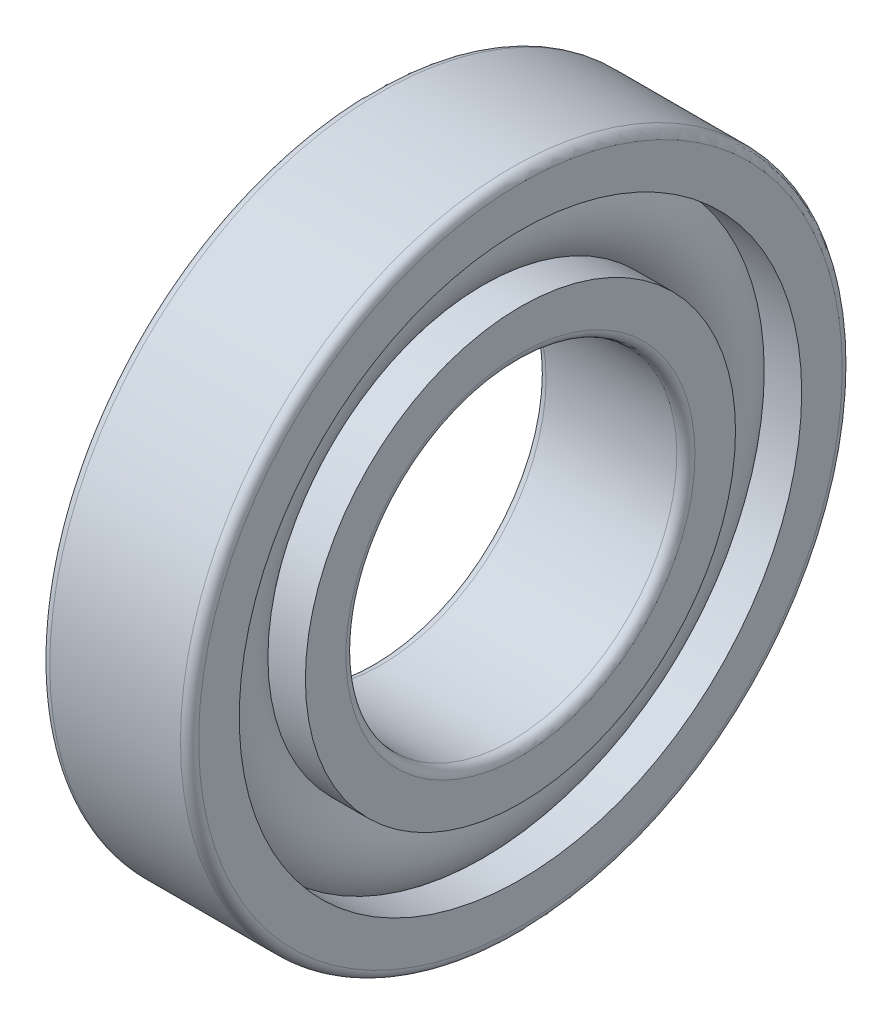
ISO-10303-21;
HEADER;
FILE_DESCRIPTION(('STEP AP214'),'2;1');
FILE_NAME('part.step','',(''),(''),'','','');
FILE_SCHEMA(('AUTOMOTIVE_DESIGN { 1 0 10303 214 1 1 1 1 }'));
ENDSEC;
DATA;
#1=APPLICATION_CONTEXT('core data for automotive mechanical design processes');
#2=APPLICATION_PROTOCOL_DEFINITION('international standard','automotive_design',2000,#1);
#3=PRODUCT_CONTEXT('',#1,'mechanical');
#4=PRODUCT('Part','Part','',(#3));
#5=PRODUCT_RELATED_PRODUCT_CATEGORY('part','',(#4));
#6=PRODUCT_DEFINITION_FORMATION('','',#4);
#7=PRODUCT_DEFINITION_CONTEXT('part definition',#1,'design');
#8=PRODUCT_DEFINITION('design','',#6,#7);
#9=PRODUCT_DEFINITION_SHAPE('','',#8);
#10=(LENGTH_UNIT() NAMED_UNIT(*) SI_UNIT(.MILLI.,.METRE.));
#11=(NAMED_UNIT(*) PLANE_ANGLE_UNIT() SI_UNIT($,.RADIAN.));
#12=(NAMED_UNIT(*) SI_UNIT($,.STERADIAN.) SOLID_ANGLE_UNIT());
#13=UNCERTAINTY_MEASURE_WITH_UNIT(LENGTH_MEASURE(1.E-05),#10,'distance_accuracy_value','');
#14=(GEOMETRIC_REPRESENTATION_CONTEXT(3) GLOBAL_UNCERTAINTY_ASSIGNED_CONTEXT((#13)) GLOBAL_UNIT_ASSIGNED_CONTEXT((#10,
#11,#12)) REPRESENTATION_CONTEXT('',''));
#15=CARTESIAN_POINT('',(0.,0.,0.));
#16=DIRECTION('',(0.,0.,1.));
#17=DIRECTION('',(1.,0.,0.));
#18=AXIS2_PLACEMENT_3D('',#15,#16,#17);
#19=CARTESIAN_POINT('',(0.,0.,0.));
#20=DIRECTION('',(-1.,0.,0.));
#21=DIRECTION('',(0.,0.,1.));
#22=AXIS2_PLACEMENT_3D('',#19,#20,#21);
#23=TOROIDAL_SURFACE('',#22,30.,6.);
#24=CARTESIAN_POINT('',(4.47213595499958,0.,0.));
#25=DIRECTION('',(-1.,0.,0.));
#26=DIRECTION('',(0.,0.,1.));
#27=AXIS2_PLACEMENT_3D('',#24,#25,#26);
#28=CIRCLE('',#27,34.);
#29=CARTESIAN_POINT('',(4.47213595499958,0.,34.));
#30=VERTEX_POINT('',#29);
#31=EDGE_CURVE('E17',#30,#30,#28,.F.);
#32=ORIENTED_EDGE('',*,*,#31,.T.);
#33=EDGE_LOOP('',(#32));
#34=FACE_BOUND('',#33,.T.);
#35=CARTESIAN_POINT('',(4.47213595499958,0.,0.));
#36=DIRECTION('',(-1.,0.,0.));
#37=DIRECTION('',(0.,0.,1.));
#38=AXIS2_PLACEMENT_3D('',#35,#36,#37);
#39=CIRCLE('',#38,26.);
#40=CARTESIAN_POINT('',(4.47213595499958,0.,26.));
#41=VERTEX_POINT('',#40);
#42=EDGE_CURVE('E8',#41,#41,#39,.T.);
#43=ORIENTED_EDGE('',*,*,#42,.T.);
#44=EDGE_LOOP('',(#43));
#45=FACE_BOUND('',#44,.T.);
#46=ADVANCED_FACE('F13',(#34,#45),#23,.T.);
#47=CARTESIAN_POINT('',(-20.6375,0.,0.));
#48=DIRECTION('',(1.,0.,0.));
#49=DIRECTION('',(0.,0.,-1.));
#50=AXIS2_PLACEMENT_3D('',#47,#48,#49);
#51=CYLINDRICAL_SURFACE('',#50,26.);
#52=CARTESIAN_POINT('',(9.,0.,0.));
#53=DIRECTION('',(1.,0.,0.));
#54=DIRECTION('',(0.,0.,-1.));
#55=AXIS2_PLACEMENT_3D('',#52,#53,#54);
#56=CIRCLE('',#55,26.);
#57=CARTESIAN_POINT('',(9.,0.,-26.));
#58=VERTEX_POINT('',#57);
#59=EDGE_CURVE('E26',#58,#58,#56,.T.);
#60=ORIENTED_EDGE('',*,*,#59,.F.);
#61=EDGE_LOOP('',(#60));
#62=FACE_BOUND('',#61,.T.);
#63=ORIENTED_EDGE('',*,*,#42,.F.);
#64=EDGE_LOOP('',(#63));
#65=FACE_BOUND('',#64,.T.);
#66=ADVANCED_FACE('F65',(#62,#65),#51,.T.);
#67=CARTESIAN_POINT('',(-20.6375,0.,0.));
#68=DIRECTION('',(1.,0.,0.));
#69=DIRECTION('',(0.,0.,-1.));
#70=AXIS2_PLACEMENT_3D('',#67,#68,#69);
#71=CYLINDRICAL_SURFACE('',#70,26.);
#72=CARTESIAN_POINT('',(-9.,0.,0.));
#73=DIRECTION('',(1.,0.,0.));
#74=DIRECTION('',(0.,0.,-1.));
#75=AXIS2_PLACEMENT_3D('',#72,#73,#74);
#76=CIRCLE('',#75,26.);
#77=CARTESIAN_POINT('',(-9.,0.,-26.));
#78=VERTEX_POINT('',#77);
#79=EDGE_CURVE('E35',#78,#78,#76,.T.);
#80=ORIENTED_EDGE('',*,*,#79,.T.);
#81=EDGE_LOOP('',(#80));
#82=FACE_BOUND('',#81,.T.);
#83=CARTESIAN_POINT('',(-4.47213595499958,0.,0.));
#84=DIRECTION('',(1.,0.,0.));
#85=DIRECTION('',(0.,0.,-1.));
#86=AXIS2_PLACEMENT_3D('',#83,#84,#85);
#87=CIRCLE('',#86,26.);
#88=CARTESIAN_POINT('',(-4.47213595499958,0.,-26.));
#89=VERTEX_POINT('',#88);
#90=EDGE_CURVE('E21',#89,#89,#87,.T.);
#91=ORIENTED_EDGE('',*,*,#90,.F.);
#92=EDGE_LOOP('',(#91));
#93=FACE_BOUND('',#92,.T.);
#94=ADVANCED_FACE('F68',(#82,#93),#71,.T.);
#95=CARTESIAN_POINT('',(9.,21.1,0.));
#96=DIRECTION('',(1.,0.,0.));
#97=DIRECTION('',(0.,0.,-1.));
#98=AXIS2_PLACEMENT_3D('',#95,#96,#97);
#99=PLANE('',#98);
#100=ORIENTED_EDGE('',*,*,#59,.T.);
#101=EDGE_LOOP('',(#100));
#102=FACE_BOUND('',#101,.T.);
#103=CARTESIAN_POINT('',(9.00000000000001,0.,0.));
#104=DIRECTION('',(1.,0.,0.));
#105=DIRECTION('',(0.,0.,-1.));
#106=AXIS2_PLACEMENT_3D('',#103,#104,#105);
#107=CIRCLE('',#106,21.1);
#108=CARTESIAN_POINT('',(9.00000000000001,0.,-21.1));
#109=VERTEX_POINT('',#108);
#110=EDGE_CURVE('E57',#109,#109,#107,.T.);
#111=ORIENTED_EDGE('',*,*,#110,.F.);
#112=EDGE_LOOP('',(#111));
#113=FACE_BOUND('',#112,.T.);
#114=ADVANCED_FACE('F62',(#102,#113),#99,.T.);
#115=CARTESIAN_POINT('',(7.9,0.,0.));
#116=DIRECTION('',(1.,0.,0.));
#117=DIRECTION('',(0.,0.,-1.));
#118=AXIS2_PLACEMENT_3D('',#115,#116,#117);
#119=TOROIDAL_SURFACE('',#118,21.1,1.10000000000001);
#120=ORIENTED_EDGE('',*,*,#110,.T.);
#121=EDGE_LOOP('',(#120));
#122=FACE_BOUND('',#121,.T.);
#123=CARTESIAN_POINT('',(7.9,0.,0.));
#124=DIRECTION('',(1.,0.,0.));
#125=DIRECTION('',(0.,0.,-1.));
#126=AXIS2_PLACEMENT_3D('',#123,#124,#125);
#127=CIRCLE('',#126,20.);
#128=CARTESIAN_POINT('',(7.9,0.,-20.));
#129=VERTEX_POINT('',#128);
#130=EDGE_CURVE('E54',#129,#129,#127,.T.);
#131=ORIENTED_EDGE('',*,*,#130,.F.);
#132=EDGE_LOOP('',(#131));
#133=FACE_BOUND('',#132,.T.);
#134=ADVANCED_FACE('F80',(#122,#133),#119,.T.);
#135=CARTESIAN_POINT('',(-20.6375,0.,0.));
#136=DIRECTION('',(1.,0.,0.));
#137=DIRECTION('',(0.,0.,-1.));
#138=AXIS2_PLACEMENT_3D('',#135,#136,#137);
#139=CYLINDRICAL_SURFACE('',#138,20.);
#140=ORIENTED_EDGE('',*,*,#130,.T.);
#141=EDGE_LOOP('',(#140));
#142=FACE_BOUND('',#141,.T.);
#143=CARTESIAN_POINT('',(-7.9,0.,0.));
#144=DIRECTION('',(1.,0.,0.));
#145=DIRECTION('',(0.,0.,-1.));
#146=AXIS2_PLACEMENT_3D('',#143,#144,#145);
#147=CIRCLE('',#146,20.);
#148=CARTESIAN_POINT('',(-7.9,0.,-20.));
#149=VERTEX_POINT('',#148);
#150=EDGE_CURVE('E51',#149,#149,#147,.T.);
#151=ORIENTED_EDGE('',*,*,#150,.F.);
#152=EDGE_LOOP('',(#151));
#153=FACE_BOUND('',#152,.T.);
#154=ADVANCED_FACE('F83',(#142,#153),#139,.F.);
#155=CARTESIAN_POINT('',(-7.9,0.,0.));
#156=DIRECTION('',(1.,0.,0.));
#157=DIRECTION('',(0.,0.,-1.));
#158=AXIS2_PLACEMENT_3D('',#155,#156,#157);
#159=TOROIDAL_SURFACE('',#158,21.1,1.10000000000001);
#160=ORIENTED_EDGE('',*,*,#150,.T.);
#161=EDGE_LOOP('',(#160));
#162=FACE_BOUND('',#161,.T.);
#163=CARTESIAN_POINT('',(-9.,0.,0.));
#164=DIRECTION('',(1.,0.,0.));
#165=DIRECTION('',(0.,0.,-1.));
#166=AXIS2_PLACEMENT_3D('',#163,#164,#165);
#167=CIRCLE('',#166,21.1);
#168=CARTESIAN_POINT('',(-9.,0.,-21.1));
#169=VERTEX_POINT('',#168);
#170=EDGE_CURVE('E48',#169,#169,#167,.T.);
#171=ORIENTED_EDGE('',*,*,#170,.F.);
#172=EDGE_LOOP('',(#171));
#173=FACE_BOUND('',#172,.T.);
#174=ADVANCED_FACE('F87',(#162,#173),#159,.T.);
#175=CARTESIAN_POINT('',(-9.,26.,0.));
#176=DIRECTION('',(-1.,0.,0.));
#177=DIRECTION('',(0.,0.,1.));
#178=AXIS2_PLACEMENT_3D('',#175,#176,#177);
#179=PLANE('',#178);
#180=ORIENTED_EDGE('',*,*,#170,.T.);
#181=EDGE_LOOP('',(#180));
#182=FACE_BOUND('',#181,.T.);
#183=ORIENTED_EDGE('',*,*,#79,.F.);
#184=EDGE_LOOP('',(#183));
#185=FACE_BOUND('',#184,.T.);
#186=ADVANCED_FACE('F91',(#182,#185),#179,.T.);
#187=CARTESIAN_POINT('',(-4.47213595499958,0.,0.));
#188=DIRECTION('',(1.,0.,0.));
#189=DIRECTION('',(0.,0.,-1.));
#190=AXIS2_PLACEMENT_3D('',#187,#188,#189);
#191=CIRCLE('',#190,34.);
#192=CARTESIAN_POINT('',(-4.47213595499958,0.,-34.));
#193=VERTEX_POINT('',#192);
#194=EDGE_CURVE('E29',#193,#193,#191,.F.);
#195=ORIENTED_EDGE('',*,*,#194,.T.);
#196=EDGE_LOOP('',(#195));
#197=FACE_BOUND('',#196,.T.);
#198=ORIENTED_EDGE('',*,*,#90,.T.);
#199=EDGE_LOOP('',(#198));
#200=FACE_BOUND('',#199,.T.);
#201=ADVANCED_FACE('F15',(#197,#200),#23,.T.);
#202=CARTESIAN_POINT('',(-20.6375,0.,0.));
#203=DIRECTION('',(1.,0.,0.));
#204=DIRECTION('',(0.,0.,-1.));
#205=AXIS2_PLACEMENT_3D('',#202,#203,#204);
#206=CYLINDRICAL_SURFACE('',#205,34.);
#207=CARTESIAN_POINT('',(9.,0.,0.));
#208=DIRECTION('',(1.,0.,0.));
#209=DIRECTION('',(0.,0.,-1.));
#210=AXIS2_PLACEMENT_3D('',#207,#208,#209);
#211=CIRCLE('',#210,34.);
#212=CARTESIAN_POINT('',(9.,0.,-34.));
#213=VERTEX_POINT('',#212);
#214=EDGE_CURVE('E31',#213,#213,#211,.T.);
#215=ORIENTED_EDGE('',*,*,#214,.T.);
#216=EDGE_LOOP('',(#215));
#217=FACE_BOUND('',#216,.T.);
#218=ORIENTED_EDGE('',*,*,#31,.F.);
#219=EDGE_LOOP('',(#218));
#220=FACE_BOUND('',#219,.T.);
#221=ADVANCED_FACE('F96',(#217,#220),#206,.F.);
#222=CARTESIAN_POINT('',(-20.6375,0.,0.));
#223=DIRECTION('',(1.,0.,0.));
#224=DIRECTION('',(0.,0.,-1.));
#225=AXIS2_PLACEMENT_3D('',#222,#223,#224);
#226=CYLINDRICAL_SURFACE('',#225,34.);
#227=CARTESIAN_POINT('',(-9.,0.,0.));
#228=DIRECTION('',(1.,0.,0.));
#229=DIRECTION('',(0.,0.,-1.));
#230=AXIS2_PLACEMENT_3D('',#227,#228,#229);
#231=CIRCLE('',#230,34.);
#232=CARTESIAN_POINT('',(-9.,0.,-34.));
#233=VERTEX_POINT('',#232);
#234=EDGE_CURVE('E127',#233,#233,#231,.T.);
#235=ORIENTED_EDGE('',*,*,#234,.F.);
#236=EDGE_LOOP('',(#235));
#237=FACE_BOUND('',#236,.T.);
#238=ORIENTED_EDGE('',*,*,#194,.F.);
#239=EDGE_LOOP('',(#238));
#240=FACE_BOUND('',#239,.T.);
#241=ADVANCED_FACE('F99',(#237,#240),#226,.F.);
#242=CARTESIAN_POINT('',(9.,38.9,0.));
#243=DIRECTION('',(1.,0.,0.));
#244=DIRECTION('',(0.,0.,-1.));
#245=AXIS2_PLACEMENT_3D('',#242,#243,#244);
#246=PLANE('',#245);
#247=CARTESIAN_POINT('',(9.,0.,0.));
#248=DIRECTION('',(1.,0.,0.));
#249=DIRECTION('',(0.,0.,-1.));
#250=AXIS2_PLACEMENT_3D('',#247,#248,#249);
#251=CIRCLE('',#250,38.9);
#252=CARTESIAN_POINT('',(9.,0.,-38.9));
#253=VERTEX_POINT('',#252);
#254=EDGE_CURVE('E37',#253,#253,#251,.T.);
#255=ORIENTED_EDGE('',*,*,#254,.T.);
#256=EDGE_LOOP('',(#255));
#257=FACE_BOUND('',#256,.T.);
#258=ORIENTED_EDGE('',*,*,#214,.F.);
#259=EDGE_LOOP('',(#258));
#260=FACE_BOUND('',#259,.T.);
#261=ADVANCED_FACE('F100',(#257,#260),#246,.T.);
#262=CARTESIAN_POINT('',(7.9,0.,0.));
#263=DIRECTION('',(1.,0.,0.));
#264=DIRECTION('',(0.,0.,-1.));
#265=AXIS2_PLACEMENT_3D('',#262,#263,#264);
#266=TOROIDAL_SURFACE('',#265,38.9,1.1);
#267=CARTESIAN_POINT('',(7.9,0.,0.));
#268=DIRECTION('',(1.,0.,0.));
#269=DIRECTION('',(0.,0.,-1.));
#270=AXIS2_PLACEMENT_3D('',#267,#268,#269);
#271=CIRCLE('',#270,40.);
#272=CARTESIAN_POINT('',(7.9,0.,-40.));
#273=VERTEX_POINT('',#272);
#274=EDGE_CURVE('E42',#273,#273,#271,.T.);
#275=ORIENTED_EDGE('',*,*,#274,.T.);
#276=EDGE_LOOP('',(#275));
#277=FACE_BOUND('',#276,.T.);
#278=ORIENTED_EDGE('',*,*,#254,.F.);
#279=EDGE_LOOP('',(#278));
#280=FACE_BOUND('',#279,.T.);
#281=ADVANCED_FACE('F103',(#277,#280),#266,.T.);
#282=CARTESIAN_POINT('',(-20.6375,0.,0.));
#283=DIRECTION('',(1.,0.,0.));
#284=DIRECTION('',(0.,0.,-1.));
#285=AXIS2_PLACEMENT_3D('',#282,#283,#284);
#286=CYLINDRICAL_SURFACE('',#285,40.);
#287=CARTESIAN_POINT('',(-7.9,0.,0.));
#288=DIRECTION('',(1.,0.,0.));
#289=DIRECTION('',(0.,0.,-1.));
#290=AXIS2_PLACEMENT_3D('',#287,#288,#289);
#291=CIRCLE('',#290,40.);
#292=CARTESIAN_POINT('',(-7.9,0.,-40.));
#293=VERTEX_POINT('',#292);
#294=EDGE_CURVE('E131',#293,#293,#291,.T.);
#295=ORIENTED_EDGE('',*,*,#294,.T.);
#296=EDGE_LOOP('',(#295));
#297=FACE_BOUND('',#296,.T.);
#298=ORIENTED_EDGE('',*,*,#274,.F.);
#299=EDGE_LOOP('',(#298));
#300=FACE_BOUND('',#299,.T.);
#301=ADVANCED_FACE('F107',(#297,#300),#286,.T.);
#302=CARTESIAN_POINT('',(-7.9,0.,0.));
#303=DIRECTION('',(1.,0.,0.));
#304=DIRECTION('',(0.,0.,-1.));
#305=AXIS2_PLACEMENT_3D('',#302,#303,#304);
#306=TOROIDAL_SURFACE('',#305,38.9,1.1);
#307=CARTESIAN_POINT('',(-9.,0.,0.));
#308=DIRECTION('',(1.,0.,0.));
#309=DIRECTION('',(0.,0.,-1.));
#310=AXIS2_PLACEMENT_3D('',#307,#308,#309);
#311=CIRCLE('',#310,38.9);
#312=CARTESIAN_POINT('',(-9.,0.,-38.9));
#313=VERTEX_POINT('',#312);
#314=EDGE_CURVE('E128',#313,#313,#311,.T.);
#315=ORIENTED_EDGE('',*,*,#314,.T.);
#316=EDGE_LOOP('',(#315));
#317=FACE_BOUND('',#316,.T.);
#318=ORIENTED_EDGE('',*,*,#294,.F.);
#319=EDGE_LOOP('',(#318));
#320=FACE_BOUND('',#319,.T.);
#321=ADVANCED_FACE('F111',(#317,#320),#306,.T.);
#322=CARTESIAN_POINT('',(-9.,34.,0.));
#323=DIRECTION('',(-1.,0.,0.));
#324=DIRECTION('',(0.,0.,1.));
#325=AXIS2_PLACEMENT_3D('',#322,#323,#324);
#326=PLANE('',#325);
#327=ORIENTED_EDGE('',*,*,#234,.T.);
#328=EDGE_LOOP('',(#327));
#329=FACE_BOUND('',#328,.T.);
#330=ORIENTED_EDGE('',*,*,#314,.F.);
#331=EDGE_LOOP('',(#330));
#332=FACE_BOUND('',#331,.T.);
#333=ADVANCED_FACE('F115',(#329,#332),#326,.T.);
#334=CLOSED_SHELL('',(#46,#66,#94,#114,#134,#154,#174,#186,#201,#221,#241,#261,#281,#301,#321,#333));
#335=MANIFOLD_SOLID_BREP('B1',#334);
#336=ADVANCED_BREP_SHAPE_REPRESENTATION('',(#18,#335),#14);
#337=SHAPE_DEFINITION_REPRESENTATION(#9,#336);
ENDSEC;
END-ISO-10303-21;
